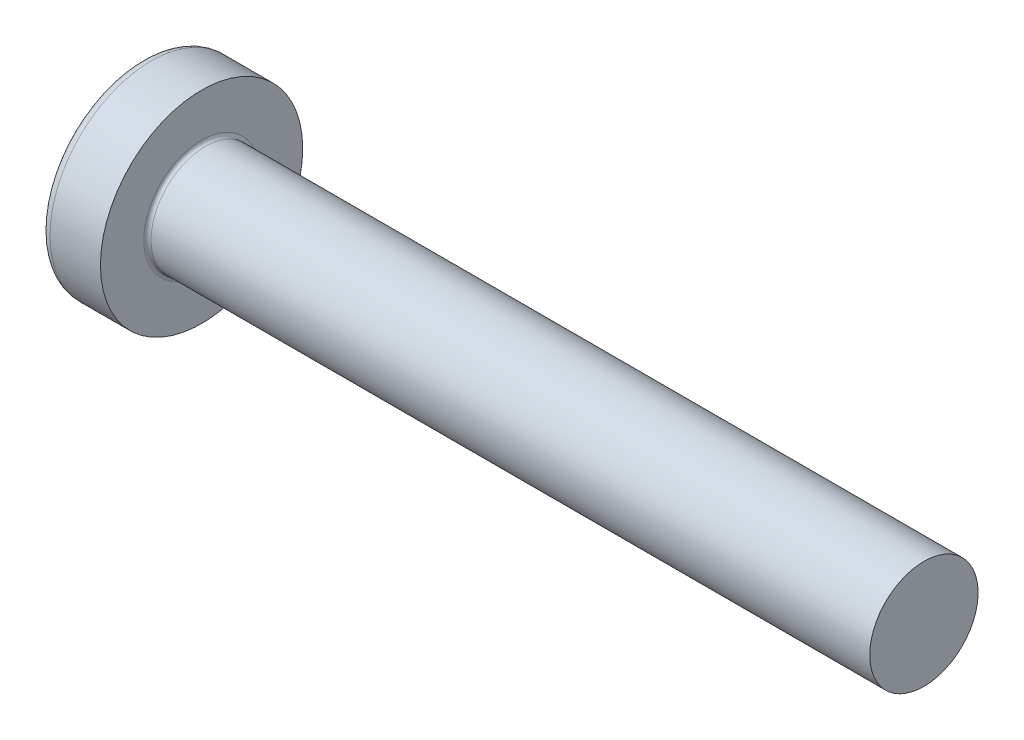
ISO-10303-21;
HEADER;
FILE_DESCRIPTION(('STEP AP214'),'2;1');
FILE_NAME('part.step','',(''),(''),'','','');
FILE_SCHEMA(('AUTOMOTIVE_DESIGN { 1 0 10303 214 1 1 1 1 }'));
ENDSEC;
DATA;
#1=APPLICATION_CONTEXT('core data for automotive mechanical design processes');
#2=APPLICATION_PROTOCOL_DEFINITION('international standard','automotive_design',2000,#1);
#3=PRODUCT_CONTEXT('',#1,'mechanical');
#4=PRODUCT('Part','Part','',(#3));
#5=PRODUCT_RELATED_PRODUCT_CATEGORY('part','',(#4));
#6=PRODUCT_DEFINITION_FORMATION('','',#4);
#7=PRODUCT_DEFINITION_CONTEXT('part definition',#1,'design');
#8=PRODUCT_DEFINITION('design','',#6,#7);
#9=PRODUCT_DEFINITION_SHAPE('','',#8);
#10=(LENGTH_UNIT() NAMED_UNIT(*) SI_UNIT(.MILLI.,.METRE.));
#11=(NAMED_UNIT(*) PLANE_ANGLE_UNIT() SI_UNIT($,.RADIAN.));
#12=(NAMED_UNIT(*) SI_UNIT($,.STERADIAN.) SOLID_ANGLE_UNIT());
#13=UNCERTAINTY_MEASURE_WITH_UNIT(LENGTH_MEASURE(1.E-05),#10,'distance_accuracy_value','');
#14=(GEOMETRIC_REPRESENTATION_CONTEXT(3) GLOBAL_UNCERTAINTY_ASSIGNED_CONTEXT((#13)) GLOBAL_UNIT_ASSIGNED_CONTEXT((#10,
#11,#12)) REPRESENTATION_CONTEXT('',''));
#15=CARTESIAN_POINT('',(0.,0.,0.));
#16=DIRECTION('',(0.,0.,1.));
#17=DIRECTION('',(1.,0.,0.));
#18=AXIS2_PLACEMENT_3D('',#15,#16,#17);
#19=CARTESIAN_POINT('',(5.,0.,0.));
#20=DIRECTION('',(-1.,0.,0.));
#21=DIRECTION('',(0.,1.,0.));
#22=AXIS2_PLACEMENT_3D('',#19,#20,#21);
#23=SPHERICAL_SURFACE('',#22,5.);
#24=CARTESIAN_POINT('',(0.775371598933733,0.,0.));
#25=DIRECTION('',(-1.,0.,0.));
#26=DIRECTION('',(0.,0.,1.));
#27=AXIS2_PLACEMENT_3D('',#24,#25,#26);
#28=CIRCLE('',#27,2.67441860465116);
#29=CARTESIAN_POINT('',(0.775371598933733,0.,2.67441860465116));
#30=VERTEX_POINT('',#29);
#31=EDGE_CURVE('E239',#30,#30,#28,.T.);
#32=ORIENTED_EDGE('',*,*,#31,.T.);
#33=EDGE_LOOP('',(#32));
#34=FACE_BOUND('',#33,.T.);
#35=CARTESIAN_POINT('',(0.0457951200896417,0.,0.));
#36=DIRECTION('',(1.,0.,0.));
#37=DIRECTION('',(0.,0.,-1.));
#38=AXIS2_PLACEMENT_3D('',#35,#36,#37);
#39=CIRCLE('',#38,0.675169614150692);
#40=CARTESIAN_POINT('',(0.0457951200896417,-0.369999999999997,-0.564760133040919));
#41=VERTEX_POINT('',#40);
#42=CARTESIAN_POINT('',(0.0457951200896417,-0.564760133040924,-0.37));
#43=VERTEX_POINT('',#42);
#44=EDGE_CURVE('E375',#41,#43,#39,.F.);
#45=ORIENTED_EDGE('',*,*,#44,.F.);
#46=CARTESIAN_POINT('',(5.,-0.370000000000002,0.));
#47=DIRECTION('',(0.,1.,0.));
#48=DIRECTION('',(0.,0.,1.));
#49=AXIS2_PLACEMENT_3D('',#46,#47,#48);
#50=CIRCLE('',#49,4.98629120689917);
#51=CARTESIAN_POINT('',(0.187869734228639,-0.369999999999995,-1.30633162146802));
#52=VERTEX_POINT('',#51);
#53=EDGE_CURVE('E301',#52,#41,#50,.T.);
#54=ORIENTED_EDGE('',*,*,#53,.F.);
#55=CARTESIAN_POINT('',(4.56358262530798,0.,0.875317983305919));
#56=DIRECTION('',(0.446197753347436,0.,-0.894934391398443));
#57=DIRECTION('',(-0.894934391398443,0.,-0.446197753347436));
#58=AXIS2_PLACEMENT_3D('',#55,#56,#57);
#59=CIRCLE('',#58,4.90340272700175);
#60=CARTESIAN_POINT('',(0.187869734228639,0.370000000000005,-1.30633162146802));
#61=VERTEX_POINT('',#60);
#62=EDGE_CURVE('E273',#52,#61,#59,.T.);
#63=ORIENTED_EDGE('',*,*,#62,.T.);
#64=CARTESIAN_POINT('',(5.,0.369999999999999,0.));
#65=DIRECTION('',(0.,-1.,0.));
#66=DIRECTION('',(0.,0.,-1.));
#67=AXIS2_PLACEMENT_3D('',#64,#65,#66);
#68=CIRCLE('',#67,4.98629120689917);
#69=CARTESIAN_POINT('',(0.0457951200896424,0.370000000000002,-0.564760133040916));
#70=VERTEX_POINT('',#69);
#71=EDGE_CURVE('E328',#70,#61,#68,.T.);
#72=ORIENTED_EDGE('',*,*,#71,.F.);
#73=CARTESIAN_POINT('',(0.0457951200896417,0.564760133040913,-0.37));
#74=VERTEX_POINT('',#73);
#75=EDGE_CURVE('E394',#74,#70,#39,.F.);
#76=ORIENTED_EDGE('',*,*,#75,.F.);
#77=CARTESIAN_POINT('',(5.,0.,-0.369999999999999));
#78=DIRECTION('',(0.,0.,1.));
#79=DIRECTION('',(1.,0.,0.));
#80=AXIS2_PLACEMENT_3D('',#77,#78,#79);
#81=CIRCLE('',#80,4.98629120689917);
#82=CARTESIAN_POINT('',(0.187869734228641,1.30633162146802,-0.37));
#83=VERTEX_POINT('',#82);
#84=EDGE_CURVE('E267',#83,#74,#81,.T.);
#85=ORIENTED_EDGE('',*,*,#84,.F.);
#86=CARTESIAN_POINT('',(4.56358262530798,-0.875317983305921,0.));
#87=DIRECTION('',(0.446197753347436,0.894934391398443,0.));
#88=DIRECTION('',(-0.894934391398443,0.446197753347436,0.));
#89=AXIS2_PLACEMENT_3D('',#86,#87,#88);
#90=CIRCLE('',#89,4.90340272700175);
#91=CARTESIAN_POINT('',(0.187869734228641,1.30633162146802,0.370000000000001));
#92=VERTEX_POINT('',#91);
#93=EDGE_CURVE('E270',#83,#92,#90,.T.);
#94=ORIENTED_EDGE('',*,*,#93,.T.);
#95=CARTESIAN_POINT('',(5.,0.,0.370000000000002));
#96=DIRECTION('',(0.,0.,-1.));
#97=DIRECTION('',(-1.,0.,0.));
#98=AXIS2_PLACEMENT_3D('',#95,#96,#97);
#99=CIRCLE('',#98,4.98629120689917);
#100=CARTESIAN_POINT('',(0.0457951200896417,0.564760133040909,0.369999999999999));
#101=VERTEX_POINT('',#100);
#102=EDGE_CURVE('E263',#101,#92,#99,.T.);
#103=ORIENTED_EDGE('',*,*,#102,.F.);
#104=CARTESIAN_POINT('',(0.0457951200896434,0.369999999999998,0.564760133040918));
#105=VERTEX_POINT('',#104);
#106=EDGE_CURVE('E432',#105,#101,#39,.F.);
#107=ORIENTED_EDGE('',*,*,#106,.F.);
#108=CARTESIAN_POINT('',(0.18786973422864,0.369999999999995,1.30633162146802));
#109=VERTEX_POINT('',#108);
#110=EDGE_CURVE('E283',#109,#105,#68,.T.);
#111=ORIENTED_EDGE('',*,*,#110,.F.);
#112=CARTESIAN_POINT('',(4.56358262530798,0.,-0.87531798330592));
#113=DIRECTION('',(0.446197753347436,0.,0.894934391398443));
#114=DIRECTION('',(0.894934391398443,0.,-0.446197753347436));
#115=AXIS2_PLACEMENT_3D('',#112,#113,#114);
#116=CIRCLE('',#115,4.90340272700175);
#117=CARTESIAN_POINT('',(0.187869734228639,-0.370000000000006,1.30633162146802));
#118=VERTEX_POINT('',#117);
#119=EDGE_CURVE('E50',#109,#118,#116,.T.);
#120=ORIENTED_EDGE('',*,*,#119,.T.);
#121=CARTESIAN_POINT('',(0.0457951200896408,-0.370000000000001,0.564760133040917));
#122=VERTEX_POINT('',#121);
#123=EDGE_CURVE('E280',#122,#118,#50,.T.);
#124=ORIENTED_EDGE('',*,*,#123,.F.);
#125=CARTESIAN_POINT('',(0.0457951200896417,-0.56476013304092,0.369999999999999));
#126=VERTEX_POINT('',#125);
#127=EDGE_CURVE('E393',#126,#122,#39,.F.);
#128=ORIENTED_EDGE('',*,*,#127,.F.);
#129=CARTESIAN_POINT('',(0.187869734228638,-1.30633162146802,0.369999999999999));
#130=VERTEX_POINT('',#129);
#131=EDGE_CURVE('E264',#130,#126,#99,.T.);
#132=ORIENTED_EDGE('',*,*,#131,.F.);
#133=CARTESIAN_POINT('',(4.56358262530798,0.875317983305917,0.));
#134=DIRECTION('',(0.446197753347436,-0.894934391398443,0.));
#135=DIRECTION('',(0.894934391398443,0.446197753347436,0.));
#136=AXIS2_PLACEMENT_3D('',#133,#134,#135);
#137=CIRCLE('',#136,4.90340272700175);
#138=CARTESIAN_POINT('',(0.187869734228638,-1.30633162146802,-0.37));
#139=VERTEX_POINT('',#138);
#140=EDGE_CURVE('E260',#130,#139,#137,.T.);
#141=ORIENTED_EDGE('',*,*,#140,.T.);
#142=EDGE_CURVE('E65',#43,#139,#81,.T.);
#143=ORIENTED_EDGE('',*,*,#142,.F.);
#144=EDGE_LOOP('',(#45,#54,#63,#72,#76,#85,#94,#103,#107,#111,#120,#124,#128,#132,#141,#143));
#145=FACE_BOUND('',#144,.T.);
#146=ADVANCED_FACE('F36',(#34,#145),#23,.T.);
#147=CARTESIAN_POINT('',(1.75,0.527482331818931,-0.37));
#148=DIRECTION('',(0.,0.,1.));
#149=DIRECTION('',(1.,0.,0.));
#150=AXIS2_PLACEMENT_3D('',#147,#148,#149);
#151=PLANE('',#150);
#152=ORIENTED_EDGE('',*,*,#84,.T.);
#153=CARTESIAN_POINT('',(-0.987293237069636,0.649401255968442,-0.37));
#154=CARTESIAN_POINT('',(-0.781914975331302,0.632865887004023,-0.37));
#155=CARTESIAN_POINT('',(-0.576547882405889,0.616188977636102,-0.37));
#156=CARTESIAN_POINT('',(-0.165841599235441,0.582441031964983,-0.37));
#157=CARTESIAN_POINT('',(0.0394975903016328,0.5653699870555,-0.37));
#158=CARTESIAN_POINT('',(0.4501334754206,0.530723441326706,-0.37));
#159=CARTESIAN_POINT('',(0.65543017101234,0.513147940624409,-0.37));
#160=CARTESIAN_POINT('',(1.06596140178858,0.477314957984981,-0.37));
#161=CARTESIAN_POINT('',(1.27119593782008,0.459057485804908,-0.37));
#162=CARTESIAN_POINT('',(1.61065292367297,0.428051938687225,-0.37));
#163=CARTESIAN_POINT('',(1.74490059997313,0.415580824989367,-0.37));
#164=CARTESIAN_POINT('',(2.01334321764434,0.390092023403371,-0.37));
#165=CARTESIAN_POINT('',(2.14753815936247,0.377074339175719,-0.37));
#166=CARTESIAN_POINT('',(2.41586354153627,0.350315629451146,-0.37));
#167=CARTESIAN_POINT('',(2.54999397846979,0.336574568175918,-0.37));
#168=CARTESIAN_POINT('',(2.8181417329714,0.308004077740054,-0.37));
#169=CARTESIAN_POINT('',(2.95215904766802,0.29317462174519,-0.37));
#170=CARTESIAN_POINT('',(3.08609550685347,0.277618485069874,-0.37));
#171=B_SPLINE_CURVE_WITH_KNOTS('',3,(#153,#154,#155,#156,#157,#158,#159,#160,#161,#162,#163,
#164,#165,#166,#167,#168,#169,#170),.UNSPECIFIED.,.F.,.F.,(4,2,2,2,2,2,2,2,4),(0.,
0.61812879398981,1.23627109813549,1.85441325889711,2.47254657920086,2.87702276221884,
3.28149623681437,3.68598973554218,4.09049321035586),.UNSPECIFIED.);
#172=CARTESIAN_POINT('',(1.75,0.415013252800437,-0.37));
#173=VERTEX_POINT('',#172);
#174=EDGE_CURVE('E417',#74,#173,#171,.T.);
#175=ORIENTED_EDGE('',*,*,#174,.T.);
#176=DIRECTION('',(0.,1.,0.));
#177=VECTOR('',#176,1.);
#178=CARTESIAN_POINT('',(1.75,-0.527482331818932,-0.37));
#179=LINE('',#178,#177);
#180=CARTESIAN_POINT('',(1.75,0.527482331818931,-0.37));
#181=VERTEX_POINT('',#180);
#182=EDGE_CURVE('E357',#173,#181,#179,.T.);
#183=ORIENTED_EDGE('',*,*,#182,.T.);
#184=DIRECTION('',(0.894934391398442,-0.446197753347436,0.));
#185=VECTOR('',#184,1.);
#186=CARTESIAN_POINT('',(0.,1.4,-0.37));
#187=LINE('',#186,#185);
#188=EDGE_CURVE('E240',#83,#181,#187,.T.);
#189=ORIENTED_EDGE('',*,*,#188,.F.);
#190=EDGE_LOOP('',(#152,#175,#183,#189));
#191=FACE_BOUND('',#190,.T.);
#192=ADVANCED_FACE('F195',(#191),#151,.T.);
#193=CARTESIAN_POINT('',(1.75,-0.527482331818932,-0.37));
#194=VERTEX_POINT('',#193);
#195=CARTESIAN_POINT('',(1.75,-0.415013252800437,-0.37));
#196=VERTEX_POINT('',#195);
#197=EDGE_CURVE('E248',#194,#196,#179,.T.);
#198=ORIENTED_EDGE('',*,*,#197,.T.);
#199=CARTESIAN_POINT('',(-0.987293237069636,-0.649401255968442,-0.37));
#200=CARTESIAN_POINT('',(-0.781914975331303,-0.632865887004023,-0.37));
#201=CARTESIAN_POINT('',(-0.57654788240589,-0.616188977636102,-0.37));
#202=CARTESIAN_POINT('',(-0.165841599235441,-0.582441031964983,-0.37));
#203=CARTESIAN_POINT('',(0.0394975903016326,-0.5653699870555,-0.37));
#204=CARTESIAN_POINT('',(0.4501334754206,-0.530723441326706,-0.37));
#205=CARTESIAN_POINT('',(0.65543017101234,-0.513147940624409,-0.37));
#206=CARTESIAN_POINT('',(1.06596140178858,-0.477314957984981,-0.37));
#207=CARTESIAN_POINT('',(1.27119593782008,-0.459057485804908,-0.37));
#208=CARTESIAN_POINT('',(1.61065292367297,-0.428051938687225,-0.37));
#209=CARTESIAN_POINT('',(1.74490059997313,-0.415580824989368,-0.37));
#210=CARTESIAN_POINT('',(2.01334321764433,-0.390092023403371,-0.37));
#211=CARTESIAN_POINT('',(2.14753815936247,-0.377074339175718,-0.37));
#212=CARTESIAN_POINT('',(2.41586354153627,-0.350315629451146,-0.37));
#213=CARTESIAN_POINT('',(2.54999397846979,-0.336574568175918,-0.37));
#214=CARTESIAN_POINT('',(2.8181417329714,-0.308004077740054,-0.37));
#215=CARTESIAN_POINT('',(2.95215904766802,-0.29317462174519,-0.37));
#216=CARTESIAN_POINT('',(3.08609550685347,-0.277618485069873,-0.37));
#217=B_SPLINE_CURVE_WITH_KNOTS('',3,(#199,#200,#201,#202,#203,#204,#205,#206,#207,#208,#209,
#210,#211,#212,#213,#214,#215,#216),.UNSPECIFIED.,.F.,.F.,(4,2,2,2,2,2,2,2,4),(0.,
0.61812879398981,1.2362710981355,1.85441325889711,2.47254657920086,2.87702276221884,
3.28149623681437,3.68598973554218,4.09049321035587),.UNSPECIFIED.);
#218=EDGE_CURVE('E392',#196,#43,#217,.F.);
#219=ORIENTED_EDGE('',*,*,#218,.T.);
#220=ORIENTED_EDGE('',*,*,#142,.T.);
#221=DIRECTION('',(0.894934391398443,0.446197753347436,0.));
#222=VECTOR('',#221,1.);
#223=CARTESIAN_POINT('',(0.,-1.4,-0.37));
#224=LINE('',#223,#222);
#225=EDGE_CURVE('E331',#139,#194,#224,.T.);
#226=ORIENTED_EDGE('',*,*,#225,.T.);
#227=EDGE_LOOP('',(#198,#219,#220,#226));
#228=FACE_BOUND('',#227,.T.);
#229=ADVANCED_FACE('F201',(#228),#151,.T.);
#230=CARTESIAN_POINT('',(1.75,-0.527482331818932,0.37));
#231=DIRECTION('',(0.,0.,-1.));
#232=DIRECTION('',(-1.,0.,0.));
#233=AXIS2_PLACEMENT_3D('',#230,#231,#232);
#234=PLANE('',#233);
#235=DIRECTION('',(0.,-1.,0.));
#236=VECTOR('',#235,1.);
#237=CARTESIAN_POINT('',(1.75,0.527482331818931,0.37));
#238=LINE('',#237,#236);
#239=CARTESIAN_POINT('',(1.75,0.527482331818931,0.37));
#240=VERTEX_POINT('',#239);
#241=CARTESIAN_POINT('',(1.75,0.415013252800437,0.37));
#242=VERTEX_POINT('',#241);
#243=EDGE_CURVE('E340',#240,#242,#238,.T.);
#244=ORIENTED_EDGE('',*,*,#243,.T.);
#245=CARTESIAN_POINT('',(-0.987293237053716,0.649401255967162,0.369999999999998));
#246=CARTESIAN_POINT('',(-0.781914975317084,0.632865887002872,0.369999999999998));
#247=CARTESIAN_POINT('',(-0.576547882393372,0.616188977635082,0.369999999999998));
#248=CARTESIAN_POINT('',(-0.165841599226327,0.582441031964228,0.369999999999999));
#249=CARTESIAN_POINT('',(0.0394975903090454,0.56536998705488,0.369999999999999));
#250=CARTESIAN_POINT('',(0.450133475422572,0.530723441326535,0.369999999999999));
#251=CARTESIAN_POINT('',(0.655430171010573,0.513147940624557,0.369999999999999));
#252=CARTESIAN_POINT('',(1.06596140177934,0.477314957985794,0.37));
#253=CARTESIAN_POINT('',(1.2711959378071,0.459057485806066,0.37));
#254=CARTESIAN_POINT('',(1.61065292365626,0.428051938688769,0.37));
#255=CARTESIAN_POINT('',(1.74490059995643,0.415580824990931,0.37));
#256=CARTESIAN_POINT('',(2.01334321762763,0.390092023404979,0.37));
#257=CARTESIAN_POINT('',(2.14753815934577,0.377074339177353,0.37));
#258=CARTESIAN_POINT('',(2.41586354151957,0.350315629452842,0.37));
#259=CARTESIAN_POINT('',(2.5499939784531,0.336574568177649,0.370000000000001));
#260=CARTESIAN_POINT('',(2.81814173295471,0.308004077741874,0.370000000000001));
#261=CARTESIAN_POINT('',(2.95215904765134,0.293174621747063,0.370000000000001));
#262=CARTESIAN_POINT('',(3.0860955068368,0.277618485071814,0.370000000000001));
#263=B_SPLINE_CURVE_WITH_KNOTS('',3,(#245,#246,#247,#248,#249,#250,#251,#252,#253,#254,#255,
#256,#257,#258,#259,#260,#261,#262),.UNSPECIFIED.,.F.,.F.,(4,2,2,2,2,2,2,2,4),(0.,
0.618128793984691,1.23627109812525,1.85441325887562,2.4725465791681,2.87702276218609,
3.28149623678161,3.68598973550942,4.09049321032311),.UNSPECIFIED.);
#264=EDGE_CURVE('E433',#242,#101,#263,.F.);
#265=ORIENTED_EDGE('',*,*,#264,.T.);
#266=ORIENTED_EDGE('',*,*,#102,.T.);
#267=DIRECTION('',(0.894934391398442,-0.446197753347436,0.));
#268=VECTOR('',#267,1.);
#269=CARTESIAN_POINT('',(0.,1.4,0.37));
#270=LINE('',#269,#268);
#271=EDGE_CURVE('E245',#92,#240,#270,.T.);
#272=ORIENTED_EDGE('',*,*,#271,.T.);
#273=EDGE_LOOP('',(#244,#265,#266,#272));
#274=FACE_BOUND('',#273,.T.);
#275=ADVANCED_FACE('F413',(#274),#234,.T.);
#276=ORIENTED_EDGE('',*,*,#131,.T.);
#277=CARTESIAN_POINT('',(-0.987293237053716,-0.649401255967162,0.369999999999998));
#278=CARTESIAN_POINT('',(-0.781914975317084,-0.632865887002872,0.369999999999998));
#279=CARTESIAN_POINT('',(-0.576547882393373,-0.616188977635082,0.369999999999999));
#280=CARTESIAN_POINT('',(-0.165841599226327,-0.582441031964228,0.369999999999999));
#281=CARTESIAN_POINT('',(0.0394975903090454,-0.56536998705488,0.369999999999999));
#282=CARTESIAN_POINT('',(0.450133475422572,-0.530723441326535,0.369999999999999));
#283=CARTESIAN_POINT('',(0.655430171010573,-0.513147940624557,0.369999999999999));
#284=CARTESIAN_POINT('',(1.06596140177934,-0.477314957985794,0.37));
#285=CARTESIAN_POINT('',(1.2711959378071,-0.459057485806066,0.37));
#286=CARTESIAN_POINT('',(1.61065292365626,-0.428051938688769,0.37));
#287=CARTESIAN_POINT('',(1.74490059995643,-0.415580824990931,0.37));
#288=CARTESIAN_POINT('',(2.01334321762763,-0.390092023404979,0.37));
#289=CARTESIAN_POINT('',(2.14753815934577,-0.377074339177353,0.37));
#290=CARTESIAN_POINT('',(2.41586354151957,-0.350315629452842,0.370000000000001));
#291=CARTESIAN_POINT('',(2.5499939784531,-0.336574568177649,0.370000000000001));
#292=CARTESIAN_POINT('',(2.81814173295471,-0.308004077741874,0.370000000000001));
#293=CARTESIAN_POINT('',(2.95215904765134,-0.293174621747064,0.370000000000001));
#294=CARTESIAN_POINT('',(3.0860955068368,-0.277618485071814,0.370000000000001));
#295=B_SPLINE_CURVE_WITH_KNOTS('',3,(#277,#278,#279,#280,#281,#282,#283,#284,#285,#286,#287,
#288,#289,#290,#291,#292,#293,#294),.UNSPECIFIED.,.F.,.F.,(4,2,2,2,2,2,2,2,4),(0.,
0.618128793984691,1.23627109812525,1.85441325887562,2.4725465791681,2.87702276218609,
3.28149623678161,3.68598973550942,4.09049321032311),.UNSPECIFIED.);
#296=CARTESIAN_POINT('',(1.75,-0.415013252800437,0.370000000000001));
#297=VERTEX_POINT('',#296);
#298=EDGE_CURVE('E454',#126,#297,#295,.T.);
#299=ORIENTED_EDGE('',*,*,#298,.T.);
#300=CARTESIAN_POINT('',(1.75,-0.527482331818932,0.37));
#301=VERTEX_POINT('',#300);
#302=EDGE_CURVE('E342',#297,#301,#238,.T.);
#303=ORIENTED_EDGE('',*,*,#302,.T.);
#304=DIRECTION('',(0.894934391398443,0.446197753347436,0.));
#305=VECTOR('',#304,1.);
#306=CARTESIAN_POINT('',(0.,-1.4,0.369999999999999));
#307=LINE('',#306,#305);
#308=EDGE_CURVE('E333',#130,#301,#307,.T.);
#309=ORIENTED_EDGE('',*,*,#308,.F.);
#310=EDGE_LOOP('',(#276,#299,#303,#309));
#311=FACE_BOUND('',#310,.T.);
#312=ADVANCED_FACE('F516',(#311),#234,.T.);
#313=CARTESIAN_POINT('',(1.75,0.527482331818931,0.37));
#314=DIRECTION('',(0.446197753347436,0.894934391398443,0.));
#315=DIRECTION('',(-0.894934391398443,0.446197753347436,0.));
#316=AXIS2_PLACEMENT_3D('',#313,#314,#315);
#317=PLANE('',#316);
#318=CARTESIAN_POINT('',(2.6696526882832,0.0689604923233255,0.));
#319=DIRECTION('',(0.446197753347436,0.894934391398443,0.));
#320=DIRECTION('',(-0.894934391398443,0.446197753347436,0.));
#321=AXIS2_PLACEMENT_3D('',#318,#319,#320);
#322=ELLIPSE('',#321,1.10195897609153,0.486831694838766);
#323=CARTESIAN_POINT('',(1.75,0.527482331818932,0.175779377683682));
#324=VERTEX_POINT('',#323);
#325=CARTESIAN_POINT('',(1.75,0.527482331818932,-0.175779377683682));
#326=VERTEX_POINT('',#325);
#327=EDGE_CURVE('E306',#324,#326,#322,.F.);
#328=ORIENTED_EDGE('',*,*,#327,.F.);
#329=DIRECTION('',(0.,0.,-1.));
#330=VECTOR('',#329,1.);
#331=CARTESIAN_POINT('',(1.75,0.527482331818931,0.37));
#332=LINE('',#331,#330);
#333=EDGE_CURVE('E343',#240,#324,#332,.T.);
#334=ORIENTED_EDGE('',*,*,#333,.F.);
#335=ORIENTED_EDGE('',*,*,#271,.F.);
#336=ORIENTED_EDGE('',*,*,#93,.F.);
#337=ORIENTED_EDGE('',*,*,#188,.T.);
#338=EDGE_CURVE('E345',#326,#181,#332,.T.);
#339=ORIENTED_EDGE('',*,*,#338,.F.);
#340=EDGE_LOOP('',(#328,#334,#335,#336,#337,#339));
#341=FACE_BOUND('',#340,.T.);
#342=ADVANCED_FACE('F411',(#341),#317,.F.);
#343=CARTESIAN_POINT('',(1.75,-0.527482331818932,-0.37));
#344=DIRECTION('',(0.446197753347436,-0.894934391398443,0.));
#345=DIRECTION('',(0.894934391398443,0.446197753347436,0.));
#346=AXIS2_PLACEMENT_3D('',#343,#344,#345);
#347=PLANE('',#346);
#348=CARTESIAN_POINT('',(2.6696526882832,-0.0689604923233255,0.));
#349=DIRECTION('',(0.446197753347436,-0.894934391398443,0.));
#350=DIRECTION('',(-0.894934391398443,-0.446197753347436,0.));
#351=AXIS2_PLACEMENT_3D('',#348,#349,#350);
#352=ELLIPSE('',#351,1.10195897609154,0.486831694838766);
#353=CARTESIAN_POINT('',(1.75,-0.527482331818932,-0.175779377683679));
#354=VERTEX_POINT('',#353);
#355=CARTESIAN_POINT('',(1.75,-0.527482331818932,0.175779377683679));
#356=VERTEX_POINT('',#355);
#357=EDGE_CURVE('E460',#354,#356,#352,.F.);
#358=ORIENTED_EDGE('',*,*,#357,.F.);
#359=DIRECTION('',(0.,0.,1.));
#360=VECTOR('',#359,1.);
#361=CARTESIAN_POINT('',(1.75,-0.527482331818932,-0.37));
#362=LINE('',#361,#360);
#363=EDGE_CURVE('E336',#194,#354,#362,.T.);
#364=ORIENTED_EDGE('',*,*,#363,.F.);
#365=ORIENTED_EDGE('',*,*,#225,.F.);
#366=ORIENTED_EDGE('',*,*,#140,.F.);
#367=ORIENTED_EDGE('',*,*,#308,.T.);
#368=EDGE_CURVE('E339',#356,#301,#362,.T.);
#369=ORIENTED_EDGE('',*,*,#368,.F.);
#370=EDGE_LOOP('',(#358,#364,#365,#366,#367,#369));
#371=FACE_BOUND('',#370,.T.);
#372=ADVANCED_FACE('F508',(#371),#347,.F.);
#373=CARTESIAN_POINT('',(1.75,-0.527482331818932,-0.37));
#374=DIRECTION('',(1.,0.,0.));
#375=DIRECTION('',(0.,0.,-1.));
#376=AXIS2_PLACEMENT_3D('',#373,#374,#375);
#377=PLANE('',#376);
#378=CARTESIAN_POINT('',(1.75,0.,0.));
#379=DIRECTION('',(-1.,0.,0.));
#380=DIRECTION('',(0.,0.,1.));
#381=AXIS2_PLACEMENT_3D('',#378,#379,#380);
#382=CIRCLE('',#381,0.556);
#383=CARTESIAN_POINT('',(1.75,-0.175779377683679,-0.527482331818933));
#384=VERTEX_POINT('',#383);
#385=CARTESIAN_POINT('',(1.75,-0.369999999999999,-0.415013252800438));
#386=VERTEX_POINT('',#385);
#387=EDGE_CURVE('E57',#384,#386,#382,.T.);
#388=ORIENTED_EDGE('',*,*,#387,.F.);
#389=DIRECTION('',(0.,-1.,0.));
#390=VECTOR('',#389,1.);
#391=CARTESIAN_POINT('',(1.75,0.370000000000002,-0.527482331818931));
#392=LINE('',#391,#390);
#393=CARTESIAN_POINT('',(1.75,-0.369999999999998,-0.527482331818933));
#394=VERTEX_POINT('',#393);
#395=EDGE_CURVE('E316',#384,#394,#392,.T.);
#396=ORIENTED_EDGE('',*,*,#395,.T.);
#397=DIRECTION('',(0.,0.,-1.));
#398=VECTOR('',#397,1.);
#399=CARTESIAN_POINT('',(1.75,-0.370000000000002,0.52748233181893));
#400=LINE('',#399,#398);
#401=EDGE_CURVE('E320',#386,#394,#400,.T.);
#402=ORIENTED_EDGE('',*,*,#401,.F.);
#403=EDGE_LOOP('',(#388,#396,#402));
#404=FACE_BOUND('',#403,.T.);
#405=ADVANCED_FACE('F381',(#404),#377,.F.);
#406=EDGE_CURVE('E386',#196,#354,#382,.T.);
#407=ORIENTED_EDGE('',*,*,#406,.F.);
#408=ORIENTED_EDGE('',*,*,#197,.F.);
#409=ORIENTED_EDGE('',*,*,#363,.T.);
#410=EDGE_LOOP('',(#407,#408,#409));
#411=FACE_BOUND('',#410,.T.);
#412=ADVANCED_FACE('F515',(#411),#377,.F.);
#413=EDGE_CURVE('E523',#356,#297,#382,.T.);
#414=ORIENTED_EDGE('',*,*,#413,.F.);
#415=ORIENTED_EDGE('',*,*,#368,.T.);
#416=ORIENTED_EDGE('',*,*,#302,.F.);
#417=EDGE_LOOP('',(#414,#415,#416));
#418=FACE_BOUND('',#417,.T.);
#419=ADVANCED_FACE('F504',(#418),#377,.F.);
#420=CARTESIAN_POINT('',(1.75,-0.370000000000001,0.415013252800436));
#421=VERTEX_POINT('',#420);
#422=CARTESIAN_POINT('',(1.75,-0.175779377683685,0.527482331818931));
#423=VERTEX_POINT('',#422);
#424=EDGE_CURVE('E491',#421,#423,#382,.T.);
#425=ORIENTED_EDGE('',*,*,#424,.F.);
#426=CARTESIAN_POINT('',(1.75,-0.370000000000002,0.52748233181893));
#427=VERTEX_POINT('',#426);
#428=EDGE_CURVE('E317',#427,#421,#400,.T.);
#429=ORIENTED_EDGE('',*,*,#428,.F.);
#430=DIRECTION('',(0.,1.,0.));
#431=VECTOR('',#430,1.);
#432=CARTESIAN_POINT('',(1.75,-0.370000000000002,0.52748233181893));
#433=LINE('',#432,#431);
#434=EDGE_CURVE('E321',#427,#423,#433,.T.);
#435=ORIENTED_EDGE('',*,*,#434,.T.);
#436=EDGE_LOOP('',(#425,#429,#435));
#437=FACE_BOUND('',#436,.T.);
#438=ADVANCED_FACE('F489',(#437),#377,.F.);
#439=CARTESIAN_POINT('',(1.75,0.175779377683682,0.527482331818932));
#440=VERTEX_POINT('',#439);
#441=CARTESIAN_POINT('',(1.75,0.369999999999998,0.415013252800439));
#442=VERTEX_POINT('',#441);
#443=EDGE_CURVE('E387',#440,#442,#382,.T.);
#444=ORIENTED_EDGE('',*,*,#443,.F.);
#445=CARTESIAN_POINT('',(1.75,0.369999999999998,0.527482331818932));
#446=VERTEX_POINT('',#445);
#447=EDGE_CURVE('E324',#440,#446,#433,.T.);
#448=ORIENTED_EDGE('',*,*,#447,.T.);
#449=DIRECTION('',(0.,0.,1.));
#450=VECTOR('',#449,1.);
#451=CARTESIAN_POINT('',(1.75,0.370000000000002,-0.527482331818931));
#452=LINE('',#451,#450);
#453=EDGE_CURVE('E298',#442,#446,#452,.T.);
#454=ORIENTED_EDGE('',*,*,#453,.F.);
#455=EDGE_LOOP('',(#444,#448,#454));
#456=FACE_BOUND('',#455,.T.);
#457=ADVANCED_FACE('F497',(#456),#377,.F.);
#458=EDGE_CURVE('E474',#242,#324,#382,.T.);
#459=ORIENTED_EDGE('',*,*,#458,.F.);
#460=ORIENTED_EDGE('',*,*,#243,.F.);
#461=ORIENTED_EDGE('',*,*,#333,.T.);
#462=EDGE_LOOP('',(#459,#460,#461));
#463=FACE_BOUND('',#462,.T.);
#464=ADVANCED_FACE('F499',(#463),#377,.F.);
#465=EDGE_CURVE('E472',#326,#173,#382,.T.);
#466=ORIENTED_EDGE('',*,*,#465,.F.);
#467=ORIENTED_EDGE('',*,*,#338,.T.);
#468=ORIENTED_EDGE('',*,*,#182,.F.);
#469=EDGE_LOOP('',(#466,#467,#468));
#470=FACE_BOUND('',#469,.T.);
#471=ADVANCED_FACE('F444',(#470),#377,.F.);
#472=CARTESIAN_POINT('',(1.75,-0.369999999999998,-0.527482331818933));
#473=DIRECTION('',(0.,1.,0.));
#474=DIRECTION('',(-1.,0.,0.));
#475=AXIS2_PLACEMENT_3D('',#472,#473,#474);
#476=PLANE('',#475);
#477=ORIENTED_EDGE('',*,*,#428,.T.);
#478=CARTESIAN_POINT('',(-0.987293237069635,-0.37,0.649401255968442));
#479=CARTESIAN_POINT('',(-0.781914975331302,-0.37,0.632865887004023));
#480=CARTESIAN_POINT('',(-0.576547882405888,-0.370000000000001,0.616188977636102));
#481=CARTESIAN_POINT('',(-0.16584159923544,-0.370000000000001,0.582441031964982));
#482=CARTESIAN_POINT('',(0.0394975903016338,-0.370000000000001,0.565369987055499));
#483=CARTESIAN_POINT('',(0.450133475420601,-0.370000000000001,0.530723441326705));
#484=CARTESIAN_POINT('',(0.655430171012341,-0.370000000000001,0.513147940624408));
#485=CARTESIAN_POINT('',(1.06596140178858,-0.370000000000001,0.47731495798498));
#486=CARTESIAN_POINT('',(1.27119593782008,-0.370000000000001,0.459057485804906));
#487=CARTESIAN_POINT('',(1.61065292367297,-0.370000000000001,0.428051938687223));
#488=CARTESIAN_POINT('',(1.74490059997313,-0.370000000000001,0.415580824989366));
#489=CARTESIAN_POINT('',(2.01334321764434,-0.370000000000002,0.390092023403369));
#490=CARTESIAN_POINT('',(2.14753815936247,-0.370000000000002,0.377074339175717));
#491=CARTESIAN_POINT('',(2.41586354153627,-0.370000000000002,0.350315629451144));
#492=CARTESIAN_POINT('',(2.54999397846979,-0.370000000000002,0.336574568175916));
#493=CARTESIAN_POINT('',(2.8181417329714,-0.370000000000002,0.308004077740052));
#494=CARTESIAN_POINT('',(2.95215904766802,-0.370000000000002,0.293174621745187));
#495=CARTESIAN_POINT('',(3.08609550685347,-0.370000000000002,0.277618485069871));
#496=B_SPLINE_CURVE_WITH_KNOTS('',3,(#478,#479,#480,#481,#482,#483,#484,#485,#486,#487,#488,
#489,#490,#491,#492,#493,#494,#495),.UNSPECIFIED.,.F.,.F.,(4,2,2,2,2,2,2,2,4),(0.,
0.61812879398981,1.23627109813549,1.85441325889711,2.47254657920086,2.87702276221884,
3.28149623681436,3.68598973554217,4.09049321035586),.UNSPECIFIED.);
#497=EDGE_CURVE('E447',#421,#122,#496,.F.);
#498=ORIENTED_EDGE('',*,*,#497,.T.);
#499=ORIENTED_EDGE('',*,*,#123,.T.);
#500=DIRECTION('',(0.894934391398442,0.,-0.446197753347436));
#501=VECTOR('',#500,1.);
#502=CARTESIAN_POINT('',(0.,-0.370000000000004,1.4));
#503=LINE('',#502,#501);
#504=EDGE_CURVE('E293',#118,#427,#503,.T.);
#505=ORIENTED_EDGE('',*,*,#504,.T.);
#506=EDGE_LOOP('',(#477,#498,#499,#505));
#507=FACE_BOUND('',#506,.T.);
#508=ADVANCED_FACE('F230',(#507),#476,.T.);
#509=CARTESIAN_POINT('',(1.75,0.369999999999998,0.527482331818932));
#510=DIRECTION('',(0.,-1.,0.));
#511=DIRECTION('',(1.,0.,0.));
#512=AXIS2_PLACEMENT_3D('',#509,#510,#511);
#513=PLANE('',#512);
#514=ORIENTED_EDGE('',*,*,#110,.T.);
#515=CARTESIAN_POINT('',(-0.987293237069635,0.369999999999998,0.649401255968443));
#516=CARTESIAN_POINT('',(-0.781914975331301,0.369999999999998,0.632865887004024));
#517=CARTESIAN_POINT('',(-0.576547882405888,0.369999999999998,0.616188977636103));
#518=CARTESIAN_POINT('',(-0.16584159923544,0.369999999999998,0.582441031964984));
#519=CARTESIAN_POINT('',(0.0394975903016336,0.369999999999998,0.565369987055501));
#520=CARTESIAN_POINT('',(0.450133475420601,0.369999999999998,0.530723441326707));
#521=CARTESIAN_POINT('',(0.655430171012341,0.369999999999998,0.51314794062441));
#522=CARTESIAN_POINT('',(1.06596140178858,0.369999999999998,0.477314957984982));
#523=CARTESIAN_POINT('',(1.27119593782008,0.369999999999998,0.459057485804909));
#524=CARTESIAN_POINT('',(1.61065292367297,0.369999999999998,0.428051938687226));
#525=CARTESIAN_POINT('',(1.74490059997313,0.369999999999998,0.415580824989369));
#526=CARTESIAN_POINT('',(2.01334321764434,0.369999999999998,0.390092023403372));
#527=CARTESIAN_POINT('',(2.14753815936247,0.369999999999998,0.37707433917572));
#528=CARTESIAN_POINT('',(2.41586354153627,0.369999999999999,0.350315629451147));
#529=CARTESIAN_POINT('',(2.54999397846979,0.369999999999999,0.336574568175919));
#530=CARTESIAN_POINT('',(2.8181417329714,0.369999999999999,0.308004077740055));
#531=CARTESIAN_POINT('',(2.95215904766802,0.369999999999999,0.293174621745191));
#532=CARTESIAN_POINT('',(3.08609550685347,0.369999999999999,0.277618485069875));
#533=B_SPLINE_CURVE_WITH_KNOTS('',3,(#515,#516,#517,#518,#519,#520,#521,#522,#523,#524,#525,
#526,#527,#528,#529,#530,#531,#532),.UNSPECIFIED.,.F.,.F.,(4,2,2,2,2,2,2,2,4),(0.,
0.61812879398981,1.23627109813549,1.85441325889711,2.47254657920086,2.87702276221884,
3.28149623681437,3.68598973554218,4.09049321035586),.UNSPECIFIED.);
#534=EDGE_CURVE('E426',#105,#442,#533,.T.);
#535=ORIENTED_EDGE('',*,*,#534,.T.);
#536=ORIENTED_EDGE('',*,*,#453,.T.);
#537=DIRECTION('',(0.894934391398442,0.,-0.446197753347436));
#538=VECTOR('',#537,1.);
#539=CARTESIAN_POINT('',(0.,0.369999999999995,1.4));
#540=LINE('',#539,#538);
#541=EDGE_CURVE('E291',#109,#446,#540,.T.);
#542=ORIENTED_EDGE('',*,*,#541,.F.);
#543=EDGE_LOOP('',(#514,#535,#536,#542));
#544=FACE_BOUND('',#543,.T.);
#545=ADVANCED_FACE('F295',(#544),#513,.T.);
#546=CARTESIAN_POINT('',(1.75,-0.370000000000002,0.52748233181893));
#547=DIRECTION('',(0.446197753347436,0.,0.894934391398443));
#548=DIRECTION('',(-0.894934391398443,0.,0.446197753347436));
#549=AXIS2_PLACEMENT_3D('',#546,#547,#548);
#550=PLANE('',#549);
#551=CARTESIAN_POINT('',(2.6696526882832,0.,0.0689604923233255));
#552=DIRECTION('',(0.446197753347436,0.,0.894934391398443));
#553=DIRECTION('',(-0.894934391398443,0.,0.446197753347436));
#554=AXIS2_PLACEMENT_3D('',#551,#552,#553);
#555=ELLIPSE('',#554,1.10195897609153,0.486831694838766);
#556=EDGE_CURVE('E424',#423,#440,#555,.F.);
#557=ORIENTED_EDGE('',*,*,#556,.F.);
#558=ORIENTED_EDGE('',*,*,#434,.F.);
#559=ORIENTED_EDGE('',*,*,#504,.F.);
#560=ORIENTED_EDGE('',*,*,#119,.F.);
#561=ORIENTED_EDGE('',*,*,#541,.T.);
#562=ORIENTED_EDGE('',*,*,#447,.F.);
#563=EDGE_LOOP('',(#557,#558,#559,#560,#561,#562));
#564=FACE_BOUND('',#563,.T.);
#565=ADVANCED_FACE('F289',(#564),#550,.F.);
#566=CARTESIAN_POINT('',(1.75,0.370000000000002,-0.527482331818931));
#567=DIRECTION('',(0.446197753347436,0.,-0.894934391398443));
#568=DIRECTION('',(0.894934391398443,0.,0.446197753347436));
#569=AXIS2_PLACEMENT_3D('',#566,#567,#568);
#570=PLANE('',#569);
#571=CARTESIAN_POINT('',(2.6696526882832,0.,-0.0689604923233255));
#572=DIRECTION('',(0.446197753347436,0.,-0.894934391398443));
#573=DIRECTION('',(-0.894934391398443,0.,-0.446197753347436));
#574=AXIS2_PLACEMENT_3D('',#571,#572,#573);
#575=ELLIPSE('',#574,1.10195897609154,0.486831694838766);
#576=CARTESIAN_POINT('',(1.75,0.175779377683683,-0.527482331818931));
#577=VERTEX_POINT('',#576);
#578=EDGE_CURVE('E379',#577,#384,#575,.F.);
#579=ORIENTED_EDGE('',*,*,#578,.F.);
#580=CARTESIAN_POINT('',(1.75,0.370000000000002,-0.527482331818931));
#581=VERTEX_POINT('',#580);
#582=EDGE_CURVE('E313',#581,#577,#392,.T.);
#583=ORIENTED_EDGE('',*,*,#582,.F.);
#584=DIRECTION('',(0.894934391398443,0.,0.446197753347436));
#585=VECTOR('',#584,1.);
#586=CARTESIAN_POINT('',(0.,0.370000000000005,-1.4));
#587=LINE('',#586,#585);
#588=EDGE_CURVE('E303',#61,#581,#587,.T.);
#589=ORIENTED_EDGE('',*,*,#588,.F.);
#590=ORIENTED_EDGE('',*,*,#62,.F.);
#591=DIRECTION('',(0.894934391398443,0.,0.446197753347436));
#592=VECTOR('',#591,1.);
#593=CARTESIAN_POINT('',(0.,-0.369999999999994,-1.4));
#594=LINE('',#593,#592);
#595=EDGE_CURVE('E310',#52,#394,#594,.T.);
#596=ORIENTED_EDGE('',*,*,#595,.T.);
#597=ORIENTED_EDGE('',*,*,#395,.F.);
#598=EDGE_LOOP('',(#579,#583,#589,#590,#596,#597));
#599=FACE_BOUND('',#598,.T.);
#600=ADVANCED_FACE('F370',(#599),#570,.F.);
#601=CARTESIAN_POINT('',(1.75,0.370000000000001,-0.415013252800436));
#602=VERTEX_POINT('',#601);
#603=EDGE_CURVE('E325',#581,#602,#452,.T.);
#604=ORIENTED_EDGE('',*,*,#603,.T.);
#605=CARTESIAN_POINT('',(-0.987293237053717,0.370000000000003,-0.649401255967159));
#606=CARTESIAN_POINT('',(-0.781914975317085,0.370000000000003,-0.63286588700287));
#607=CARTESIAN_POINT('',(-0.576547882393373,0.370000000000003,-0.616188977635079));
#608=CARTESIAN_POINT('',(-0.165841599226328,0.370000000000002,-0.582441031964225));
#609=CARTESIAN_POINT('',(0.0394975903090446,0.370000000000002,-0.565369987054878));
#610=CARTESIAN_POINT('',(0.450133475422571,0.370000000000002,-0.530723441326534));
#611=CARTESIAN_POINT('',(0.655430171010572,0.370000000000002,-0.513147940624555));
#612=CARTESIAN_POINT('',(1.06596140177934,0.370000000000002,-0.477314957985792));
#613=CARTESIAN_POINT('',(1.2711959378071,0.370000000000002,-0.459057485806065));
#614=CARTESIAN_POINT('',(1.61065292365626,0.370000000000001,-0.428051938688767));
#615=CARTESIAN_POINT('',(1.74490059995642,0.370000000000001,-0.415580824990929));
#616=CARTESIAN_POINT('',(2.01334321762763,0.370000000000001,-0.390092023404978));
#617=CARTESIAN_POINT('',(2.14753815934577,0.370000000000001,-0.377074339177352));
#618=CARTESIAN_POINT('',(2.41586354151957,0.370000000000001,-0.350315629452841));
#619=CARTESIAN_POINT('',(2.5499939784531,0.370000000000001,-0.336574568177649));
#620=CARTESIAN_POINT('',(2.81814173295471,0.370000000000001,-0.308004077741874));
#621=CARTESIAN_POINT('',(2.95215904765134,0.370000000000001,-0.293174621747064));
#622=CARTESIAN_POINT('',(3.0860955068368,0.370000000000001,-0.277618485071815));
#623=B_SPLINE_CURVE_WITH_KNOTS('',3,(#605,#606,#607,#608,#609,#610,#611,#612,#613,#614,#615,
#616,#617,#618,#619,#620,#621,#622),.UNSPECIFIED.,.F.,.F.,(4,2,2,2,2,2,2,2,4),(0.,
0.618128793984691,1.23627109812525,1.85441325887562,2.4725465791681,2.87702276218609,
3.28149623678161,3.68598973550942,4.09049321032311),.UNSPECIFIED.);
#624=EDGE_CURVE('E366',#602,#70,#623,.F.);
#625=ORIENTED_EDGE('',*,*,#624,.T.);
#626=ORIENTED_EDGE('',*,*,#71,.T.);
#627=ORIENTED_EDGE('',*,*,#588,.T.);
#628=EDGE_LOOP('',(#604,#625,#626,#627));
#629=FACE_BOUND('',#628,.T.);
#630=ADVANCED_FACE('F228',(#629),#513,.T.);
#631=ORIENTED_EDGE('',*,*,#53,.T.);
#632=CARTESIAN_POINT('',(-0.987293237053718,-0.369999999999996,-0.649401255967163));
#633=CARTESIAN_POINT('',(-0.781914975317086,-0.369999999999996,-0.632865887002874));
#634=CARTESIAN_POINT('',(-0.576547882393374,-0.369999999999996,-0.616188977635083));
#635=CARTESIAN_POINT('',(-0.165841599226328,-0.369999999999997,-0.582441031964229));
#636=CARTESIAN_POINT('',(0.0394975903090439,-0.369999999999997,-0.565369987054882));
#637=CARTESIAN_POINT('',(0.450133475422571,-0.369999999999997,-0.530723441326537));
#638=CARTESIAN_POINT('',(0.655430171010572,-0.369999999999998,-0.513147940624559));
#639=CARTESIAN_POINT('',(1.06596140177933,-0.369999999999998,-0.477314957985796));
#640=CARTESIAN_POINT('',(1.2711959378071,-0.369999999999998,-0.459057485806068));
#641=CARTESIAN_POINT('',(1.61065292365626,-0.369999999999998,-0.42805193868877));
#642=CARTESIAN_POINT('',(1.74490059995642,-0.369999999999999,-0.415580824990932));
#643=CARTESIAN_POINT('',(2.01334321762763,-0.369999999999999,-0.39009202340498));
#644=CARTESIAN_POINT('',(2.14753815934577,-0.369999999999999,-0.377074339177354));
#645=CARTESIAN_POINT('',(2.41586354151957,-0.369999999999999,-0.350315629452843));
#646=CARTESIAN_POINT('',(2.5499939784531,-0.369999999999999,-0.336574568177651));
#647=CARTESIAN_POINT('',(2.81814173295471,-0.37,-0.308004077741875));
#648=CARTESIAN_POINT('',(2.95215904765134,-0.37,-0.293174621747065));
#649=CARTESIAN_POINT('',(3.0860955068368,-0.37,-0.277618485071816));
#650=B_SPLINE_CURVE_WITH_KNOTS('',3,(#632,#633,#634,#635,#636,#637,#638,#639,#640,#641,#642,
#643,#644,#645,#646,#647,#648,#649),.UNSPECIFIED.,.F.,.F.,(4,2,2,2,2,2,2,2,4),(0.,
0.618128793984691,1.23627109812526,1.85441325887562,2.47254657916811,2.87702276218609,
3.28149623678161,3.68598973550942,4.09049321032311),.UNSPECIFIED.);
#651=EDGE_CURVE('E11',#41,#386,#650,.T.);
#652=ORIENTED_EDGE('',*,*,#651,.T.);
#653=ORIENTED_EDGE('',*,*,#401,.T.);
#654=ORIENTED_EDGE('',*,*,#595,.F.);
#655=EDGE_LOOP('',(#631,#652,#653,#654));
#656=FACE_BOUND('',#655,.T.);
#657=ADVANCED_FACE('F223',(#656),#476,.T.);
#658=CARTESIAN_POINT('',(-25.4,0.,0.));
#659=DIRECTION('',(-1.,0.,0.));
#660=DIRECTION('',(0.,0.,1.));
#661=AXIS2_PLACEMENT_3D('',#658,#659,#660);
#662=CYLINDRICAL_SURFACE('',#661,1.5);
#663=CARTESIAN_POINT('',(2.5,0.,0.));
#664=DIRECTION('',(-1.,0.,0.));
#665=DIRECTION('',(0.,0.,1.));
#666=AXIS2_PLACEMENT_3D('',#663,#664,#665);
#667=CIRCLE('',#666,1.5);
#668=CARTESIAN_POINT('',(2.5,0.,1.5));
#669=VERTEX_POINT('',#668);
#670=EDGE_CURVE('E234',#669,#669,#667,.F.);
#671=ORIENTED_EDGE('',*,*,#670,.T.);
#672=EDGE_LOOP('',(#671));
#673=FACE_BOUND('',#672,.T.);
#674=CARTESIAN_POINT('',(22.4,0.,0.));
#675=DIRECTION('',(-1.,0.,0.));
#676=DIRECTION('',(0.,0.,1.));
#677=AXIS2_PLACEMENT_3D('',#674,#675,#676);
#678=CIRCLE('',#677,1.5);
#679=CARTESIAN_POINT('',(22.4,0.,1.5));
#680=VERTEX_POINT('',#679);
#681=EDGE_CURVE('E237',#680,#680,#678,.T.);
#682=ORIENTED_EDGE('',*,*,#681,.T.);
#683=EDGE_LOOP('',(#682));
#684=FACE_BOUND('',#683,.T.);
#685=ADVANCED_FACE('F220',(#673,#684),#662,.T.);
#686=CARTESIAN_POINT('',(2.4,1.5,0.));
#687=DIRECTION('',(-1.,0.,0.));
#688=DIRECTION('',(0.,0.,1.));
#689=AXIS2_PLACEMENT_3D('',#686,#687,#688);
#690=PLANE('',#689);
#691=CARTESIAN_POINT('',(2.4,0.,0.));
#692=DIRECTION('',(-1.,0.,0.));
#693=DIRECTION('',(0.,0.,1.));
#694=AXIS2_PLACEMENT_3D('',#691,#692,#693);
#695=CIRCLE('',#694,1.6);
#696=CARTESIAN_POINT('',(2.4,0.,1.6));
#697=VERTEX_POINT('',#696);
#698=EDGE_CURVE('E256',#697,#697,#695,.T.);
#699=ORIENTED_EDGE('',*,*,#698,.T.);
#700=EDGE_LOOP('',(#699));
#701=FACE_BOUND('',#700,.T.);
#702=CARTESIAN_POINT('',(2.4,0.,0.));
#703=DIRECTION('',(-1.,0.,0.));
#704=DIRECTION('',(0.,0.,1.));
#705=AXIS2_PLACEMENT_3D('',#702,#703,#704);
#706=CIRCLE('',#705,2.8);
#707=CARTESIAN_POINT('',(2.4,0.,2.8));
#708=VERTEX_POINT('',#707);
#709=EDGE_CURVE('E253',#708,#708,#706,.T.);
#710=ORIENTED_EDGE('',*,*,#709,.F.);
#711=EDGE_LOOP('',(#710));
#712=FACE_BOUND('',#711,.T.);
#713=ADVANCED_FACE('F217',(#701,#712),#690,.F.);
#714=CARTESIAN_POINT('',(-25.4,0.,0.));
#715=DIRECTION('',(-1.,0.,0.));
#716=DIRECTION('',(0.,0.,1.));
#717=AXIS2_PLACEMENT_3D('',#714,#715,#716);
#718=CYLINDRICAL_SURFACE('',#717,2.8);
#719=ORIENTED_EDGE('',*,*,#709,.T.);
#720=EDGE_LOOP('',(#719));
#721=FACE_BOUND('',#720,.T.);
#722=CARTESIAN_POINT('',(1.00350153259132,0.,0.));
#723=DIRECTION('',(-1.,0.,0.));
#724=DIRECTION('',(0.,0.,1.));
#725=AXIS2_PLACEMENT_3D('',#722,#723,#724);
#726=CIRCLE('',#725,2.8);
#727=CARTESIAN_POINT('',(1.00350153259132,0.,2.8));
#728=VERTEX_POINT('',#727);
#729=EDGE_CURVE('E242',#728,#728,#726,.T.);
#730=ORIENTED_EDGE('',*,*,#729,.F.);
#731=EDGE_LOOP('',(#730));
#732=FACE_BOUND('',#731,.T.);
#733=ADVANCED_FACE('F213',(#721,#732),#718,.T.);
#734=CARTESIAN_POINT('',(1.00350153259131,0.,0.));
#735=DIRECTION('',(-1.,0.,0.));
#736=DIRECTION('',(0.,0.,1.));
#737=AXIS2_PLACEMENT_3D('',#734,#735,#736);
#738=TOROIDAL_SURFACE('',#737,2.53,0.270000000000001);
#739=ORIENTED_EDGE('',*,*,#729,.T.);
#740=EDGE_LOOP('',(#739));
#741=FACE_BOUND('',#740,.T.);
#742=ORIENTED_EDGE('',*,*,#31,.F.);
#743=EDGE_LOOP('',(#742));
#744=FACE_BOUND('',#743,.T.);
#745=ADVANCED_FACE('F210',(#741,#744),#738,.T.);
#746=CARTESIAN_POINT('',(22.4,1.5,0.));
#747=DIRECTION('',(1.,0.,0.));
#748=DIRECTION('',(0.,0.,-1.));
#749=AXIS2_PLACEMENT_3D('',#746,#747,#748);
#750=PLANE('',#749);
#751=ORIENTED_EDGE('',*,*,#681,.F.);
#752=EDGE_LOOP('',(#751));
#753=FACE_BOUND('',#752,.T.);
#754=ADVANCED_FACE('F208',(#753),#750,.T.);
#755=CARTESIAN_POINT('',(2.5,0.,0.));
#756=DIRECTION('',(-1.,0.,0.));
#757=DIRECTION('',(0.,0.,1.));
#758=AXIS2_PLACEMENT_3D('',#755,#756,#757);
#759=TOROIDAL_SURFACE('',#758,1.6,0.1);
#760=ORIENTED_EDGE('',*,*,#670,.F.);
#761=EDGE_LOOP('',(#760));
#762=FACE_BOUND('',#761,.T.);
#763=ORIENTED_EDGE('',*,*,#698,.F.);
#764=EDGE_LOOP('',(#763));
#765=FACE_BOUND('',#764,.T.);
#766=ADVANCED_FACE('F38',(#762,#765),#759,.F.);
#767=EDGE_CURVE('E385',#602,#577,#382,.T.);
#768=ORIENTED_EDGE('',*,*,#767,.F.);
#769=ORIENTED_EDGE('',*,*,#603,.F.);
#770=ORIENTED_EDGE('',*,*,#582,.T.);
#771=EDGE_LOOP('',(#768,#769,#770));
#772=FACE_BOUND('',#771,.T.);
#773=ADVANCED_FACE('F505',(#772),#377,.F.);
#774=CARTESIAN_POINT('',(1.75,0.,0.));
#775=DIRECTION('',(-1.,0.,0.));
#776=DIRECTION('',(0.,0.,1.));
#777=AXIS2_PLACEMENT_3D('',#774,#775,#776);
#778=CONICAL_SURFACE('',#777,0.556,0.069813170079766);
#779=ORIENTED_EDGE('',*,*,#327,.T.);
#780=EDGE_CURVE('E467',#324,#326,#382,.T.);
#781=ORIENTED_EDGE('',*,*,#780,.F.);
#782=EDGE_LOOP('',(#779,#781));
#783=FACE_BOUND('',#782,.T.);
#784=ADVANCED_FACE('F192',(#783),#778,.F.);
#785=ORIENTED_EDGE('',*,*,#357,.T.);
#786=EDGE_CURVE('E522',#354,#356,#382,.T.);
#787=ORIENTED_EDGE('',*,*,#786,.F.);
#788=EDGE_LOOP('',(#785,#787));
#789=FACE_BOUND('',#788,.T.);
#790=ADVANCED_FACE('F638',(#789),#778,.F.);
#791=ORIENTED_EDGE('',*,*,#127,.T.);
#792=ORIENTED_EDGE('',*,*,#497,.F.);
#793=EDGE_CURVE('E526',#297,#421,#382,.T.);
#794=ORIENTED_EDGE('',*,*,#793,.F.);
#795=ORIENTED_EDGE('',*,*,#298,.F.);
#796=EDGE_LOOP('',(#791,#792,#794,#795));
#797=FACE_BOUND('',#796,.T.);
#798=ADVANCED_FACE('F483',(#797),#778,.F.);
#799=ORIENTED_EDGE('',*,*,#556,.T.);
#800=EDGE_CURVE('E390',#423,#440,#382,.T.);
#801=ORIENTED_EDGE('',*,*,#800,.F.);
#802=EDGE_LOOP('',(#799,#801));
#803=FACE_BOUND('',#802,.T.);
#804=ADVANCED_FACE('F494',(#803),#778,.F.);
#805=ORIENTED_EDGE('',*,*,#578,.T.);
#806=EDGE_CURVE('E382',#577,#384,#382,.T.);
#807=ORIENTED_EDGE('',*,*,#806,.F.);
#808=EDGE_LOOP('',(#805,#807));
#809=FACE_BOUND('',#808,.T.);
#810=ADVANCED_FACE('F653',(#809),#778,.F.);
#811=EDGE_CURVE('E389',#442,#242,#382,.T.);
#812=ORIENTED_EDGE('',*,*,#811,.F.);
#813=ORIENTED_EDGE('',*,*,#534,.F.);
#814=ORIENTED_EDGE('',*,*,#106,.T.);
#815=ORIENTED_EDGE('',*,*,#264,.F.);
#816=EDGE_LOOP('',(#812,#813,#814,#815));
#817=FACE_BOUND('',#816,.T.);
#818=ADVANCED_FACE('F659',(#817),#778,.F.);
#819=ORIENTED_EDGE('',*,*,#75,.T.);
#820=ORIENTED_EDGE('',*,*,#624,.F.);
#821=EDGE_CURVE('E475',#173,#602,#382,.T.);
#822=ORIENTED_EDGE('',*,*,#821,.F.);
#823=ORIENTED_EDGE('',*,*,#174,.F.);
#824=EDGE_LOOP('',(#819,#820,#822,#823));
#825=FACE_BOUND('',#824,.T.);
#826=ADVANCED_FACE('F190',(#825),#778,.F.);
#827=EDGE_CURVE('E383',#386,#196,#382,.T.);
#828=ORIENTED_EDGE('',*,*,#827,.F.);
#829=ORIENTED_EDGE('',*,*,#651,.F.);
#830=ORIENTED_EDGE('',*,*,#44,.T.);
#831=ORIENTED_EDGE('',*,*,#218,.F.);
#832=EDGE_LOOP('',(#828,#829,#830,#831));
#833=FACE_BOUND('',#832,.T.);
#834=ADVANCED_FACE('F185',(#833),#778,.F.);
#835=CARTESIAN_POINT('',(1.93065535110549,0.,0.));
#836=DIRECTION('',(-1.,0.,0.));
#837=DIRECTION('',(0.,0.,1.));
#838=AXIS2_PLACEMENT_3D('',#835,#836,#837);
#839=CONICAL_SURFACE('',#838,0.,1.25663706143592);
#840=ORIENTED_EDGE('',*,*,#443,.T.);
#841=ORIENTED_EDGE('',*,*,#811,.T.);
#842=ORIENTED_EDGE('',*,*,#458,.T.);
#843=ORIENTED_EDGE('',*,*,#780,.T.);
#844=ORIENTED_EDGE('',*,*,#465,.T.);
#845=ORIENTED_EDGE('',*,*,#821,.T.);
#846=ORIENTED_EDGE('',*,*,#767,.T.);
#847=ORIENTED_EDGE('',*,*,#806,.T.);
#848=ORIENTED_EDGE('',*,*,#387,.T.);
#849=ORIENTED_EDGE('',*,*,#827,.T.);
#850=ORIENTED_EDGE('',*,*,#406,.T.);
#851=ORIENTED_EDGE('',*,*,#786,.T.);
#852=ORIENTED_EDGE('',*,*,#413,.T.);
#853=ORIENTED_EDGE('',*,*,#793,.T.);
#854=ORIENTED_EDGE('',*,*,#424,.T.);
#855=ORIENTED_EDGE('',*,*,#800,.T.);
#856=EDGE_LOOP('',(#840,#841,#842,#843,#844,#845,#846,#847,#848,#849,#850,#851,#852,#853,#854,#855));
#857=FACE_BOUND('',#856,.T.);
#858=CARTESIAN_POINT('',(1.93065535110549,0.,0.));
#859=VERTEX_POINT('',#858);
#860=VERTEX_LOOP('',#859);
#861=FACE_BOUND('',#860,.T.);
#862=ADVANCED_FACE('F183',(#857,#861),#839,.F.);
#863=CLOSED_SHELL('',(#146,#192,#229,#275,#312,#342,#372,#405,#412,#419,#438,#457,#464,#471,
#508,#545,#565,#600,#630,#657,#685,#713,#733,#745,#754,#766,#773,#784,#790,#798,#804,#810,#818,
#826,#834,#862));
#864=MANIFOLD_SOLID_BREP('B2',#863);
#865=ADVANCED_BREP_SHAPE_REPRESENTATION('',(#18,#864),#14);
#866=SHAPE_DEFINITION_REPRESENTATION(#9,#865);
ENDSEC;
END-ISO-10303-21;
